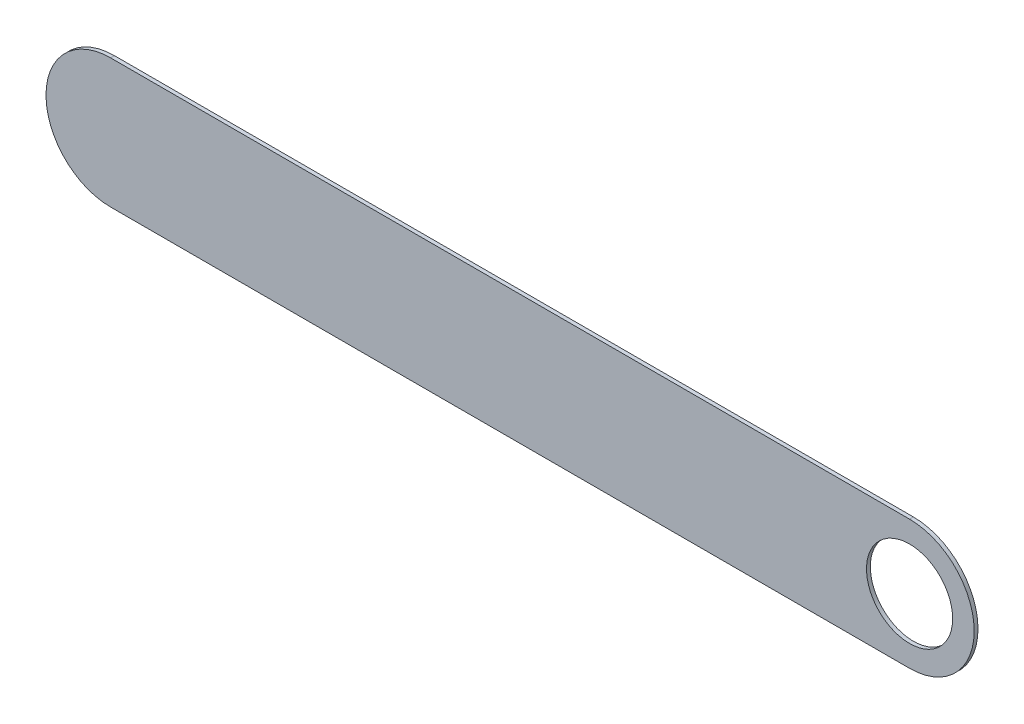
ISO-10303-21;
HEADER;
FILE_DESCRIPTION(('STEP AP214'),'2;1');
FILE_NAME('part.step','',(''),(''),'','','');
FILE_SCHEMA(('AUTOMOTIVE_DESIGN { 1 0 10303 214 1 1 1 1 }'));
ENDSEC;
DATA;
#1=APPLICATION_CONTEXT('core data for automotive mechanical design processes');
#2=APPLICATION_PROTOCOL_DEFINITION('international standard','automotive_design',2000,#1);
#3=PRODUCT_CONTEXT('',#1,'mechanical');
#4=PRODUCT('Part','Part','',(#3));
#5=PRODUCT_RELATED_PRODUCT_CATEGORY('part','',(#4));
#6=PRODUCT_DEFINITION_FORMATION('','',#4);
#7=PRODUCT_DEFINITION_CONTEXT('part definition',#1,'design');
#8=PRODUCT_DEFINITION('design','',#6,#7);
#9=PRODUCT_DEFINITION_SHAPE('','',#8);
#10=(LENGTH_UNIT() NAMED_UNIT(*) SI_UNIT(.MILLI.,.METRE.));
#11=(NAMED_UNIT(*) PLANE_ANGLE_UNIT() SI_UNIT($,.RADIAN.));
#12=(NAMED_UNIT(*) SI_UNIT($,.STERADIAN.) SOLID_ANGLE_UNIT());
#13=UNCERTAINTY_MEASURE_WITH_UNIT(LENGTH_MEASURE(1.E-05),#10,'distance_accuracy_value','');
#14=(GEOMETRIC_REPRESENTATION_CONTEXT(3) GLOBAL_UNCERTAINTY_ASSIGNED_CONTEXT((#13)) GLOBAL_UNIT_ASSIGNED_CONTEXT((#10,
#11,#12)) REPRESENTATION_CONTEXT('',''));
#15=CARTESIAN_POINT('',(0.,0.,0.));
#16=DIRECTION('',(0.,0.,1.));
#17=DIRECTION('',(1.,0.,0.));
#18=AXIS2_PLACEMENT_3D('',#15,#16,#17);
#19=CARTESIAN_POINT('',(59.3600032,82.360008,0.));
#20=DIRECTION('',(0.,1.,0.));
#21=DIRECTION('',(1.,0.,0.));
#22=AXIS2_PLACEMENT_3D('',#19,#20,#21);
#23=PLANE('',#22);
#24=DIRECTION('',(1.,0.,0.));
#25=VECTOR('',#24,1.);
#26=CARTESIAN_POINT('',(59.3600032,82.360008,0.03556));
#27=LINE('',#26,#25);
#28=CARTESIAN_POINT('',(59.3600032,82.360008,0.03556));
#29=VERTEX_POINT('',#28);
#30=CARTESIAN_POINT('',(66.7800036,82.360008,0.03556));
#31=VERTEX_POINT('',#30);
#32=EDGE_CURVE('E11',#29,#31,#27,.T.);
#33=ORIENTED_EDGE('',*,*,#32,.F.);
#34=DIRECTION('',(0.,0.,1.));
#35=VECTOR('',#34,1.);
#36=CARTESIAN_POINT('',(59.3600032,82.360008,0.));
#37=LINE('',#36,#35);
#38=CARTESIAN_POINT('',(59.3600032,82.360008,0.));
#39=VERTEX_POINT('',#38);
#40=EDGE_CURVE('E24',#39,#29,#37,.T.);
#41=ORIENTED_EDGE('',*,*,#40,.F.);
#42=DIRECTION('',(1.,0.,0.));
#43=VECTOR('',#42,1.);
#44=CARTESIAN_POINT('',(59.3600032,82.360008,0.));
#45=LINE('',#44,#43);
#46=CARTESIAN_POINT('',(66.7800036,82.360008,0.));
#47=VERTEX_POINT('',#46);
#48=EDGE_CURVE('E96',#39,#47,#45,.T.);
#49=ORIENTED_EDGE('',*,*,#48,.T.);
#50=DIRECTION('',(0.,0.,1.));
#51=VECTOR('',#50,1.);
#52=CARTESIAN_POINT('',(66.7800036,82.360008,0.));
#53=LINE('',#52,#51);
#54=EDGE_CURVE('E37',#47,#31,#53,.T.);
#55=ORIENTED_EDGE('',*,*,#54,.T.);
#56=EDGE_LOOP('',(#33,#41,#49,#55));
#57=FACE_BOUND('',#56,.T.);
#58=ADVANCED_FACE('F17',(#57),#23,.F.);
#59=CARTESIAN_POINT('',(59.3600032,82.9600068,0.));
#60=DIRECTION('',(0.,0.,-1.));
#61=DIRECTION('',(0.,1.,0.));
#62=AXIS2_PLACEMENT_3D('',#59,#60,#61);
#63=CYLINDRICAL_SURFACE('',#62,0.599998800000002);
#64=CARTESIAN_POINT('',(59.3600032,82.9600068,0.03556));
#65=DIRECTION('',(0.,0.,1.));
#66=DIRECTION('',(0.,1.,0.));
#67=AXIS2_PLACEMENT_3D('',#64,#65,#66);
#68=CIRCLE('',#67,0.599998800000002);
#69=CARTESIAN_POINT('',(59.3600032,83.5600056,0.03556));
#70=VERTEX_POINT('',#69);
#71=EDGE_CURVE('E92',#70,#29,#68,.T.);
#72=ORIENTED_EDGE('',*,*,#71,.F.);
#73=DIRECTION('',(0.,0.,1.));
#74=VECTOR('',#73,1.);
#75=CARTESIAN_POINT('',(59.3600032,83.5600056,0.));
#76=LINE('',#75,#74);
#77=CARTESIAN_POINT('',(59.3600032,83.5600056,0.));
#78=VERTEX_POINT('',#77);
#79=EDGE_CURVE('E90',#78,#70,#76,.T.);
#80=ORIENTED_EDGE('',*,*,#79,.F.);
#81=CARTESIAN_POINT('',(59.3600032,82.9600068,0.));
#82=DIRECTION('',(0.,0.,1.));
#83=DIRECTION('',(0.,1.,0.));
#84=AXIS2_PLACEMENT_3D('',#81,#82,#83);
#85=CIRCLE('',#84,0.599998800000002);
#86=EDGE_CURVE('E88',#78,#39,#85,.T.);
#87=ORIENTED_EDGE('',*,*,#86,.T.);
#88=ORIENTED_EDGE('',*,*,#40,.T.);
#89=EDGE_LOOP('',(#72,#80,#87,#88));
#90=FACE_BOUND('',#89,.T.);
#91=ADVANCED_FACE('F111',(#90),#63,.T.);
#92=CARTESIAN_POINT('',(66.7800036,82.9600068,0.));
#93=DIRECTION('',(0.,0.,-1.));
#94=DIRECTION('',(0.,-1.,0.));
#95=AXIS2_PLACEMENT_3D('',#92,#93,#94);
#96=CYLINDRICAL_SURFACE('',#95,0.599998799999999);
#97=CARTESIAN_POINT('',(66.7800036,82.9600068,0.03556));
#98=DIRECTION('',(0.,0.,1.));
#99=DIRECTION('',(0.,-1.,0.));
#100=AXIS2_PLACEMENT_3D('',#97,#98,#99);
#101=CIRCLE('',#100,0.599998799999999);
#102=CARTESIAN_POINT('',(66.7800036,83.5600056,0.03556));
#103=VERTEX_POINT('',#102);
#104=EDGE_CURVE('E85',#31,#103,#101,.T.);
#105=ORIENTED_EDGE('',*,*,#104,.F.);
#106=ORIENTED_EDGE('',*,*,#54,.F.);
#107=CARTESIAN_POINT('',(66.7800036,82.9600068,0.));
#108=DIRECTION('',(0.,0.,1.));
#109=DIRECTION('',(0.,-1.,0.));
#110=AXIS2_PLACEMENT_3D('',#107,#108,#109);
#111=CIRCLE('',#110,0.599998799999999);
#112=CARTESIAN_POINT('',(66.7800036,83.5600056,0.));
#113=VERTEX_POINT('',#112);
#114=EDGE_CURVE('E82',#47,#113,#111,.T.);
#115=ORIENTED_EDGE('',*,*,#114,.T.);
#116=DIRECTION('',(0.,0.,1.));
#117=VECTOR('',#116,1.);
#118=CARTESIAN_POINT('',(66.7800036,83.5600056,0.));
#119=LINE('',#118,#117);
#120=EDGE_CURVE('E80',#113,#103,#119,.T.);
#121=ORIENTED_EDGE('',*,*,#120,.T.);
#122=EDGE_LOOP('',(#105,#106,#115,#121));
#123=FACE_BOUND('',#122,.T.);
#124=ADVANCED_FACE('F104',(#123),#96,.T.);
#125=CARTESIAN_POINT('',(66.7800036,83.5600056,0.));
#126=DIRECTION('',(0.,-1.,0.));
#127=DIRECTION('',(-1.,0.,0.));
#128=AXIS2_PLACEMENT_3D('',#125,#126,#127);
#129=PLANE('',#128);
#130=DIRECTION('',(-1.,0.,0.));
#131=VECTOR('',#130,1.);
#132=CARTESIAN_POINT('',(66.7800036,83.5600056,0.03556));
#133=LINE('',#132,#131);
#134=EDGE_CURVE('E77',#103,#70,#133,.T.);
#135=ORIENTED_EDGE('',*,*,#134,.F.);
#136=ORIENTED_EDGE('',*,*,#120,.F.);
#137=DIRECTION('',(-1.,0.,0.));
#138=VECTOR('',#137,1.);
#139=CARTESIAN_POINT('',(66.7800036,83.5600056,0.));
#140=LINE('',#139,#138);
#141=EDGE_CURVE('E68',#113,#78,#140,.T.);
#142=ORIENTED_EDGE('',*,*,#141,.T.);
#143=ORIENTED_EDGE('',*,*,#79,.T.);
#144=EDGE_LOOP('',(#135,#136,#142,#143));
#145=FACE_BOUND('',#144,.T.);
#146=ADVANCED_FACE('F110',(#145),#129,.F.);
#147=CARTESIAN_POINT('',(66.7800036,82.9600068,0.));
#148=DIRECTION('',(0.,0.,-1.));
#149=DIRECTION('',(1.,0.,0.));
#150=AXIS2_PLACEMENT_3D('',#147,#148,#149);
#151=CYLINDRICAL_SURFACE('',#150,0.3999992);
#152=DIRECTION('',(0.,0.,1.));
#153=VECTOR('',#152,1.);
#154=CARTESIAN_POINT('',(67.1800028,82.9600068,0.));
#155=LINE('',#154,#153);
#156=CARTESIAN_POINT('',(67.1800028,82.9600068,0.));
#157=VERTEX_POINT('',#156);
#158=CARTESIAN_POINT('',(67.1800028,82.9600068,0.03556));
#159=VERTEX_POINT('',#158);
#160=EDGE_CURVE('E62',#157,#159,#155,.T.);
#161=ORIENTED_EDGE('',*,*,#160,.T.);
#162=CARTESIAN_POINT('',(66.7800036,82.9600068,0.03556));
#163=DIRECTION('',(0.,0.,1.));
#164=DIRECTION('',(1.,0.,0.));
#165=AXIS2_PLACEMENT_3D('',#162,#163,#164);
#166=CIRCLE('',#165,0.3999992);
#167=EDGE_CURVE('E67',#159,#159,#166,.T.);
#168=ORIENTED_EDGE('',*,*,#167,.T.);
#169=ORIENTED_EDGE('',*,*,#160,.F.);
#170=CARTESIAN_POINT('',(66.7800036,82.9600068,0.));
#171=DIRECTION('',(0.,0.,1.));
#172=DIRECTION('',(1.,0.,0.));
#173=AXIS2_PLACEMENT_3D('',#170,#171,#172);
#174=CIRCLE('',#173,0.3999992);
#175=EDGE_CURVE('E65',#157,#157,#174,.T.);
#176=ORIENTED_EDGE('',*,*,#175,.F.);
#177=EDGE_LOOP('',(#161,#168,#169,#176));
#178=FACE_BOUND('',#177,.T.);
#179=ADVANCED_FACE('F64',(#178),#151,.F.);
#180=CARTESIAN_POINT('',(59.3600032,82.360008,0.));
#181=DIRECTION('',(0.,0.,-1.));
#182=DIRECTION('',(-1.,0.,0.));
#183=AXIS2_PLACEMENT_3D('',#180,#181,#182);
#184=PLANE('',#183);
#185=ORIENTED_EDGE('',*,*,#48,.F.);
#186=ORIENTED_EDGE('',*,*,#86,.F.);
#187=ORIENTED_EDGE('',*,*,#141,.F.);
#188=ORIENTED_EDGE('',*,*,#114,.F.);
#189=EDGE_LOOP('',(#185,#186,#187,#188));
#190=FACE_BOUND('',#189,.T.);
#191=ORIENTED_EDGE('',*,*,#175,.T.);
#192=EDGE_LOOP('',(#191));
#193=FACE_BOUND('',#192,.T.);
#194=ADVANCED_FACE('F71',(#190,#193),#184,.T.);
#195=CARTESIAN_POINT('',(59.3600032,82.360008,0.03556));
#196=DIRECTION('',(0.,0.,-1.));
#197=DIRECTION('',(-1.,0.,0.));
#198=AXIS2_PLACEMENT_3D('',#195,#196,#197);
#199=PLANE('',#198);
#200=ORIENTED_EDGE('',*,*,#134,.T.);
#201=ORIENTED_EDGE('',*,*,#71,.T.);
#202=ORIENTED_EDGE('',*,*,#32,.T.);
#203=ORIENTED_EDGE('',*,*,#104,.T.);
#204=EDGE_LOOP('',(#200,#201,#202,#203));
#205=FACE_BOUND('',#204,.T.);
#206=ORIENTED_EDGE('',*,*,#167,.F.);
#207=EDGE_LOOP('',(#206));
#208=FACE_BOUND('',#207,.T.);
#209=ADVANCED_FACE('F107',(#205,#208),#199,.F.);
#210=CLOSED_SHELL('',(#58,#91,#124,#146,#179,#194,#209));
#211=MANIFOLD_SOLID_BREP('B1',#210);
#212=ADVANCED_BREP_SHAPE_REPRESENTATION('',(#18,#211),#14);
#213=SHAPE_DEFINITION_REPRESENTATION(#9,#212);
ENDSEC;
END-ISO-10303-21;
